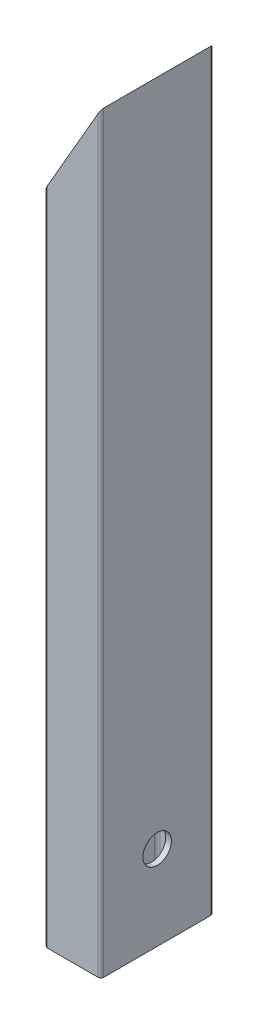
ISO-10303-21;
HEADER;
FILE_DESCRIPTION(('STEP AP214'),'2;1');
FILE_NAME('part.step','',(''),(''),'','','');
FILE_SCHEMA(('AUTOMOTIVE_DESIGN { 1 0 10303 214 1 1 1 1 }'));
ENDSEC;
DATA;
#1=APPLICATION_CONTEXT('core data for automotive mechanical design processes');
#2=APPLICATION_PROTOCOL_DEFINITION('international standard','automotive_design',2000,#1);
#3=PRODUCT_CONTEXT('',#1,'mechanical');
#4=PRODUCT('Part','Part','',(#3));
#5=PRODUCT_RELATED_PRODUCT_CATEGORY('part','',(#4));
#6=PRODUCT_DEFINITION_FORMATION('','',#4);
#7=PRODUCT_DEFINITION_CONTEXT('part definition',#1,'design');
#8=PRODUCT_DEFINITION('design','',#6,#7);
#9=PRODUCT_DEFINITION_SHAPE('','',#8);
#10=(LENGTH_UNIT() NAMED_UNIT(*) SI_UNIT(.MILLI.,.METRE.));
#11=(NAMED_UNIT(*) PLANE_ANGLE_UNIT() SI_UNIT($,.RADIAN.));
#12=(NAMED_UNIT(*) SI_UNIT($,.STERADIAN.) SOLID_ANGLE_UNIT());
#13=UNCERTAINTY_MEASURE_WITH_UNIT(LENGTH_MEASURE(1.E-05),#10,'distance_accuracy_value','');
#14=(GEOMETRIC_REPRESENTATION_CONTEXT(3) GLOBAL_UNCERTAINTY_ASSIGNED_CONTEXT((#13)) GLOBAL_UNIT_ASSIGNED_CONTEXT((#10,
#11,#12)) REPRESENTATION_CONTEXT('',''));
#15=CARTESIAN_POINT('',(0.,0.,0.));
#16=DIRECTION('',(0.,0.,1.));
#17=DIRECTION('',(1.,0.,0.));
#18=AXIS2_PLACEMENT_3D('',#15,#16,#17);
#19=CARTESIAN_POINT('',(2.,0.,-2.));
#20=DIRECTION('',(0.,-1.,0.));
#21=DIRECTION('',(0.,0.,-1.));
#22=AXIS2_PLACEMENT_3D('',#19,#20,#21);
#23=PLANE('',#22);
#24=CARTESIAN_POINT('',(2.,0.,-2.));
#25=DIRECTION('',(0.,1.,0.));
#26=DIRECTION('',(0.,0.,-1.));
#27=AXIS2_PLACEMENT_3D('',#24,#25,#26);
#28=CIRCLE('',#27,2.);
#29=CARTESIAN_POINT('',(0.,0.,-2.00000000000001));
#30=VERTEX_POINT('',#29);
#31=CARTESIAN_POINT('',(2.00000000000001,0.,0.));
#32=VERTEX_POINT('',#31);
#33=EDGE_CURVE('E238',#30,#32,#28,.T.);
#34=ORIENTED_EDGE('',*,*,#33,.F.);
#35=DIRECTION('',(0.,0.,1.));
#36=VECTOR('',#35,1.);
#37=CARTESIAN_POINT('',(0.,0.,-2.00000000000001));
#38=LINE('',#37,#36);
#39=CARTESIAN_POINT('',(0.,0.,-78.));
#40=VERTEX_POINT('',#39);
#41=EDGE_CURVE('E256',#40,#30,#38,.T.);
#42=ORIENTED_EDGE('',*,*,#41,.F.);
#43=CARTESIAN_POINT('',(2.,0.,-78.));
#44=DIRECTION('',(0.,1.,0.));
#45=DIRECTION('',(0.,0.,-1.));
#46=AXIS2_PLACEMENT_3D('',#43,#44,#45);
#47=CIRCLE('',#46,2.);
#48=CARTESIAN_POINT('',(2.,0.,-80.));
#49=VERTEX_POINT('',#48);
#50=EDGE_CURVE('E253',#49,#40,#47,.T.);
#51=ORIENTED_EDGE('',*,*,#50,.F.);
#52=DIRECTION('',(-1.,0.,0.));
#53=VECTOR('',#52,1.);
#54=CARTESIAN_POINT('',(2.,0.,-80.));
#55=LINE('',#54,#53);
#56=CARTESIAN_POINT('',(38.,0.,-80.));
#57=VERTEX_POINT('',#56);
#58=EDGE_CURVE('E250',#57,#49,#55,.T.);
#59=ORIENTED_EDGE('',*,*,#58,.F.);
#60=CARTESIAN_POINT('',(38.,0.,-78.));
#61=DIRECTION('',(0.,1.,0.));
#62=DIRECTION('',(0.,0.,-1.));
#63=AXIS2_PLACEMENT_3D('',#60,#61,#62);
#64=CIRCLE('',#63,2.);
#65=CARTESIAN_POINT('',(40.,0.,-78.));
#66=VERTEX_POINT('',#65);
#67=EDGE_CURVE('E248',#66,#57,#64,.T.);
#68=ORIENTED_EDGE('',*,*,#67,.F.);
#69=DIRECTION('',(0.,0.,-1.));
#70=VECTOR('',#69,1.);
#71=CARTESIAN_POINT('',(40.,0.,-2.00000000000001));
#72=LINE('',#71,#70);
#73=CARTESIAN_POINT('',(40.,0.,-2.00000000000001));
#74=VERTEX_POINT('',#73);
#75=EDGE_CURVE('E168',#74,#66,#72,.T.);
#76=ORIENTED_EDGE('',*,*,#75,.F.);
#77=CARTESIAN_POINT('',(38.,0.,-2.));
#78=DIRECTION('',(0.,1.,0.));
#79=DIRECTION('',(0.,0.,-1.));
#80=AXIS2_PLACEMENT_3D('',#77,#78,#79);
#81=CIRCLE('',#80,2.);
#82=CARTESIAN_POINT('',(38.,0.,0.));
#83=VERTEX_POINT('',#82);
#84=EDGE_CURVE('E244',#83,#74,#81,.T.);
#85=ORIENTED_EDGE('',*,*,#84,.F.);
#86=DIRECTION('',(1.,0.,0.));
#87=VECTOR('',#86,1.);
#88=CARTESIAN_POINT('',(2.00000000000001,0.,0.));
#89=LINE('',#88,#87);
#90=EDGE_CURVE('E241',#32,#83,#89,.T.);
#91=ORIENTED_EDGE('',*,*,#90,.F.);
#92=EDGE_LOOP('',(#34,#42,#51,#59,#68,#76,#85,#91));
#93=FACE_BOUND('',#92,.T.);
#94=DIRECTION('',(1.,0.,0.));
#95=VECTOR('',#94,1.);
#96=CARTESIAN_POINT('',(6.00000000000001,0.,-4.));
#97=LINE('',#96,#95);
#98=CARTESIAN_POINT('',(6.00000000000001,0.,-4.));
#99=VERTEX_POINT('',#98);
#100=CARTESIAN_POINT('',(34.,0.,-4.));
#101=VERTEX_POINT('',#100);
#102=EDGE_CURVE('E219',#99,#101,#97,.T.);
#103=ORIENTED_EDGE('',*,*,#102,.T.);
#104=CARTESIAN_POINT('',(34.,0.,-6.));
#105=DIRECTION('',(0.,1.,0.));
#106=DIRECTION('',(0.,0.,1.));
#107=AXIS2_PLACEMENT_3D('',#104,#105,#106);
#108=CIRCLE('',#107,2.);
#109=CARTESIAN_POINT('',(36.,0.,-6.00000000000001));
#110=VERTEX_POINT('',#109);
#111=EDGE_CURVE('E186',#101,#110,#108,.T.);
#112=ORIENTED_EDGE('',*,*,#111,.T.);
#113=DIRECTION('',(0.,0.,-1.));
#114=VECTOR('',#113,1.);
#115=CARTESIAN_POINT('',(36.,0.,-6.00000000000001));
#116=LINE('',#115,#114);
#117=CARTESIAN_POINT('',(36.,0.,-74.));
#118=VERTEX_POINT('',#117);
#119=EDGE_CURVE('E201',#110,#118,#116,.T.);
#120=ORIENTED_EDGE('',*,*,#119,.T.);
#121=CARTESIAN_POINT('',(34.,0.,-74.));
#122=DIRECTION('',(0.,1.,0.));
#123=DIRECTION('',(0.,0.,1.));
#124=AXIS2_PLACEMENT_3D('',#121,#122,#123);
#125=CIRCLE('',#124,2.);
#126=CARTESIAN_POINT('',(34.,0.,-76.));
#127=VERTEX_POINT('',#126);
#128=EDGE_CURVE('E204',#118,#127,#125,.T.);
#129=ORIENTED_EDGE('',*,*,#128,.T.);
#130=DIRECTION('',(-1.,0.,0.));
#131=VECTOR('',#130,1.);
#132=CARTESIAN_POINT('',(6.,0.,-76.));
#133=LINE('',#132,#131);
#134=CARTESIAN_POINT('',(6.,0.,-76.));
#135=VERTEX_POINT('',#134);
#136=EDGE_CURVE('E207',#127,#135,#133,.T.);
#137=ORIENTED_EDGE('',*,*,#136,.T.);
#138=CARTESIAN_POINT('',(6.,0.,-74.));
#139=DIRECTION('',(0.,1.,0.));
#140=DIRECTION('',(0.,0.,1.));
#141=AXIS2_PLACEMENT_3D('',#138,#139,#140);
#142=CIRCLE('',#141,2.);
#143=CARTESIAN_POINT('',(4.,0.,-74.));
#144=VERTEX_POINT('',#143);
#145=EDGE_CURVE('E210',#135,#144,#142,.T.);
#146=ORIENTED_EDGE('',*,*,#145,.T.);
#147=DIRECTION('',(0.,0.,1.));
#148=VECTOR('',#147,1.);
#149=CARTESIAN_POINT('',(4.,0.,-6.00000000000001));
#150=LINE('',#149,#148);
#151=CARTESIAN_POINT('',(4.,0.,-6.00000000000002));
#152=VERTEX_POINT('',#151);
#153=EDGE_CURVE('E213',#144,#152,#150,.T.);
#154=ORIENTED_EDGE('',*,*,#153,.T.);
#155=CARTESIAN_POINT('',(6.,0.,-6.));
#156=DIRECTION('',(0.,1.,0.));
#157=DIRECTION('',(0.,0.,1.));
#158=AXIS2_PLACEMENT_3D('',#155,#156,#157);
#159=CIRCLE('',#158,2.);
#160=EDGE_CURVE('E216',#152,#99,#159,.T.);
#161=ORIENTED_EDGE('',*,*,#160,.T.);
#162=EDGE_LOOP('',(#103,#112,#120,#129,#137,#146,#154,#161));
#163=FACE_BOUND('',#162,.T.);
#164=ADVANCED_FACE('F35',(#93,#163),#23,.T.);
#165=CARTESIAN_POINT('',(2.,675.,-2.));
#166=DIRECTION('',(0.,-1.,0.));
#167=DIRECTION('',(0.,0.,-1.));
#168=AXIS2_PLACEMENT_3D('',#165,#166,#167);
#169=CYLINDRICAL_SURFACE('',#168,2.);
#170=DIRECTION('',(0.,-1.,0.));
#171=VECTOR('',#170,1.);
#172=CARTESIAN_POINT('',(2.00000000000001,675.,0.));
#173=LINE('',#172,#171);
#174=CARTESIAN_POINT('',(1.99999999999997,469.182069312382,0.));
#175=VERTEX_POINT('',#174);
#176=EDGE_CURVE('E43',#175,#32,#173,.T.);
#177=ORIENTED_EDGE('',*,*,#176,.F.);
#178=CARTESIAN_POINT('',(2.,469.182069312382,-2.));
#179=DIRECTION('',(0.86602540378444,-0.499999999999998,0.));
#180=DIRECTION('',(-0.499999999999998,-0.86602540378444,0.));
#181=AXIS2_PLACEMENT_3D('',#178,#179,#180);
#182=ELLIPSE('',#181,4.00000000000002,2.);
#183=CARTESIAN_POINT('',(0.,465.717967697244,-2.00000000000002));
#184=VERTEX_POINT('',#183);
#185=EDGE_CURVE('E194',#175,#184,#182,.T.);
#186=ORIENTED_EDGE('',*,*,#185,.T.);
#187=DIRECTION('',(0.,-1.,0.));
#188=VECTOR('',#187,1.);
#189=CARTESIAN_POINT('',(0.,675.,-2.00000000000001));
#190=LINE('',#189,#188);
#191=EDGE_CURVE('E259',#184,#30,#190,.T.);
#192=ORIENTED_EDGE('',*,*,#191,.T.);
#193=ORIENTED_EDGE('',*,*,#33,.T.);
#194=EDGE_LOOP('',(#177,#186,#192,#193));
#195=FACE_BOUND('',#194,.T.);
#196=ADVANCED_FACE('F37',(#195),#169,.T.);
#197=CARTESIAN_POINT('',(2.00000000000001,675.,0.));
#198=DIRECTION('',(0.,0.,-1.));
#199=DIRECTION('',(-1.,0.,0.));
#200=AXIS2_PLACEMENT_3D('',#197,#198,#199);
#201=PLANE('',#200);
#202=DIRECTION('',(0.,-1.,0.));
#203=VECTOR('',#202,1.);
#204=CARTESIAN_POINT('',(38.,675.,0.));
#205=LINE('',#204,#203);
#206=CARTESIAN_POINT('',(38.,531.535898384862,0.));
#207=VERTEX_POINT('',#206);
#208=EDGE_CURVE('E172',#207,#83,#205,.T.);
#209=ORIENTED_EDGE('',*,*,#208,.F.);
#210=DIRECTION('',(0.499999999999998,0.86602540378444,0.));
#211=VECTOR('',#210,1.);
#212=CARTESIAN_POINT('',(40.,535.,0.));
#213=LINE('',#212,#211);
#214=EDGE_CURVE('E281',#175,#207,#213,.T.);
#215=ORIENTED_EDGE('',*,*,#214,.F.);
#216=ORIENTED_EDGE('',*,*,#176,.T.);
#217=ORIENTED_EDGE('',*,*,#90,.T.);
#218=EDGE_LOOP('',(#209,#215,#216,#217));
#219=FACE_BOUND('',#218,.T.);
#220=ADVANCED_FACE('F303',(#219),#201,.F.);
#221=CARTESIAN_POINT('',(38.,675.,-2.));
#222=DIRECTION('',(0.,-1.,0.));
#223=DIRECTION('',(0.,0.,-1.));
#224=AXIS2_PLACEMENT_3D('',#221,#222,#223);
#225=CYLINDRICAL_SURFACE('',#224,2.);
#226=DIRECTION('',(0.,-1.,0.));
#227=VECTOR('',#226,1.);
#228=CARTESIAN_POINT('',(40.,675.,-2.00000000000001));
#229=LINE('',#228,#227);
#230=CARTESIAN_POINT('',(40.,535.,-2.00000000000002));
#231=VERTEX_POINT('',#230);
#232=EDGE_CURVE('E170',#231,#74,#229,.T.);
#233=ORIENTED_EDGE('',*,*,#232,.F.);
#234=CARTESIAN_POINT('',(38.,531.535898384862,-2.));
#235=DIRECTION('',(0.86602540378444,-0.499999999999998,0.));
#236=DIRECTION('',(-0.499999999999998,-0.86602540378444,0.));
#237=AXIS2_PLACEMENT_3D('',#234,#235,#236);
#238=ELLIPSE('',#237,4.00000000000002,2.);
#239=EDGE_CURVE('E151',#231,#207,#238,.T.);
#240=ORIENTED_EDGE('',*,*,#239,.T.);
#241=ORIENTED_EDGE('',*,*,#208,.T.);
#242=ORIENTED_EDGE('',*,*,#84,.T.);
#243=EDGE_LOOP('',(#233,#240,#241,#242));
#244=FACE_BOUND('',#243,.T.);
#245=ADVANCED_FACE('F305',(#244),#225,.T.);
#246=CARTESIAN_POINT('',(40.,675.,-2.00000000000001));
#247=DIRECTION('',(-1.,0.,0.));
#248=DIRECTION('',(0.,0.,1.));
#249=AXIS2_PLACEMENT_3D('',#246,#247,#248);
#250=PLANE('',#249);
#251=CARTESIAN_POINT('',(40.,60.,-40.));
#252=DIRECTION('',(1.,0.,0.));
#253=DIRECTION('',(0.,0.,-1.));
#254=AXIS2_PLACEMENT_3D('',#251,#252,#253);
#255=CIRCLE('',#254,10.125);
#256=CARTESIAN_POINT('',(40.,60.,-50.125));
#257=VERTEX_POINT('',#256);
#258=EDGE_CURVE('E189',#257,#257,#255,.T.);
#259=ORIENTED_EDGE('',*,*,#258,.F.);
#260=EDGE_LOOP('',(#259));
#261=FACE_BOUND('',#260,.T.);
#262=DIRECTION('',(0.,-1.,0.));
#263=VECTOR('',#262,1.);
#264=CARTESIAN_POINT('',(40.,675.,-78.));
#265=LINE('',#264,#263);
#266=CARTESIAN_POINT('',(40.,535.,-78.));
#267=VERTEX_POINT('',#266);
#268=EDGE_CURVE('E162',#267,#66,#265,.T.);
#269=ORIENTED_EDGE('',*,*,#268,.F.);
#270=DIRECTION('',(0.,0.,1.));
#271=VECTOR('',#270,1.);
#272=CARTESIAN_POINT('',(40.,535.,-80.));
#273=LINE('',#272,#271);
#274=EDGE_CURVE('E145',#267,#231,#273,.T.);
#275=ORIENTED_EDGE('',*,*,#274,.T.);
#276=ORIENTED_EDGE('',*,*,#232,.T.);
#277=ORIENTED_EDGE('',*,*,#75,.T.);
#278=EDGE_LOOP('',(#269,#275,#276,#277));
#279=FACE_BOUND('',#278,.T.);
#280=ADVANCED_FACE('F166',(#261,#279),#250,.F.);
#281=CARTESIAN_POINT('',(38.,675.,-78.));
#282=DIRECTION('',(0.,-1.,0.));
#283=DIRECTION('',(0.,0.,-1.));
#284=AXIS2_PLACEMENT_3D('',#281,#282,#283);
#285=CYLINDRICAL_SURFACE('',#284,2.);
#286=DIRECTION('',(0.,-1.,0.));
#287=VECTOR('',#286,1.);
#288=CARTESIAN_POINT('',(38.,675.,-80.));
#289=LINE('',#288,#287);
#290=CARTESIAN_POINT('',(38.,531.535898384862,-80.));
#291=VERTEX_POINT('',#290);
#292=EDGE_CURVE('E164',#291,#57,#289,.T.);
#293=ORIENTED_EDGE('',*,*,#292,.F.);
#294=CARTESIAN_POINT('',(38.,531.535898384862,-78.));
#295=DIRECTION('',(0.86602540378444,-0.499999999999998,0.));
#296=DIRECTION('',(-0.499999999999998,-0.86602540378444,0.));
#297=AXIS2_PLACEMENT_3D('',#294,#295,#296);
#298=ELLIPSE('',#297,4.00000000000002,2.);
#299=EDGE_CURVE('E148',#291,#267,#298,.T.);
#300=ORIENTED_EDGE('',*,*,#299,.T.);
#301=ORIENTED_EDGE('',*,*,#268,.T.);
#302=ORIENTED_EDGE('',*,*,#67,.T.);
#303=EDGE_LOOP('',(#293,#300,#301,#302));
#304=FACE_BOUND('',#303,.T.);
#305=ADVANCED_FACE('F160',(#304),#285,.T.);
#306=CARTESIAN_POINT('',(2.,675.,-80.));
#307=DIRECTION('',(0.,0.,1.));
#308=DIRECTION('',(1.,0.,0.));
#309=AXIS2_PLACEMENT_3D('',#306,#307,#308);
#310=PLANE('',#309);
#311=DIRECTION('',(0.,-1.,0.));
#312=VECTOR('',#311,1.);
#313=CARTESIAN_POINT('',(2.,675.,-80.));
#314=LINE('',#313,#312);
#315=CARTESIAN_POINT('',(2.00000000000001,469.182069312382,-80.));
#316=VERTEX_POINT('',#315);
#317=EDGE_CURVE('E174',#316,#49,#314,.T.);
#318=ORIENTED_EDGE('',*,*,#317,.F.);
#319=DIRECTION('',(0.499999999999998,0.86602540378444,0.));
#320=VECTOR('',#319,1.);
#321=CARTESIAN_POINT('',(40.,535.,-80.));
#322=LINE('',#321,#320);
#323=EDGE_CURVE('E279',#316,#291,#322,.T.);
#324=ORIENTED_EDGE('',*,*,#323,.T.);
#325=ORIENTED_EDGE('',*,*,#292,.T.);
#326=ORIENTED_EDGE('',*,*,#58,.T.);
#327=EDGE_LOOP('',(#318,#324,#325,#326));
#328=FACE_BOUND('',#327,.T.);
#329=ADVANCED_FACE('F270',(#328),#310,.F.);
#330=CARTESIAN_POINT('',(2.,675.,-78.));
#331=DIRECTION('',(0.,-1.,0.));
#332=DIRECTION('',(0.,0.,-1.));
#333=AXIS2_PLACEMENT_3D('',#330,#331,#332);
#334=CYLINDRICAL_SURFACE('',#333,2.);
#335=DIRECTION('',(0.,-1.,0.));
#336=VECTOR('',#335,1.);
#337=CARTESIAN_POINT('',(0.,675.,-78.));
#338=LINE('',#337,#336);
#339=CARTESIAN_POINT('',(0.,465.717967697244,-78.));
#340=VERTEX_POINT('',#339);
#341=EDGE_CURVE('E261',#340,#40,#338,.T.);
#342=ORIENTED_EDGE('',*,*,#341,.F.);
#343=CARTESIAN_POINT('',(2.,469.182069312382,-78.));
#344=DIRECTION('',(0.86602540378444,-0.499999999999998,0.));
#345=DIRECTION('',(-0.499999999999998,-0.86602540378444,0.));
#346=AXIS2_PLACEMENT_3D('',#343,#344,#345);
#347=ELLIPSE('',#346,4.00000000000002,2.);
#348=EDGE_CURVE('E50',#340,#316,#347,.T.);
#349=ORIENTED_EDGE('',*,*,#348,.T.);
#350=ORIENTED_EDGE('',*,*,#317,.T.);
#351=ORIENTED_EDGE('',*,*,#50,.T.);
#352=EDGE_LOOP('',(#342,#349,#350,#351));
#353=FACE_BOUND('',#352,.T.);
#354=ADVANCED_FACE('F265',(#353),#334,.T.);
#355=CARTESIAN_POINT('',(0.,675.,-2.00000000000001));
#356=DIRECTION('',(1.,0.,0.));
#357=DIRECTION('',(0.,0.,-1.));
#358=AXIS2_PLACEMENT_3D('',#355,#356,#357);
#359=PLANE('',#358);
#360=CARTESIAN_POINT('',(0.,60.,-40.));
#361=DIRECTION('',(1.,0.,0.));
#362=DIRECTION('',(0.,0.,-1.));
#363=AXIS2_PLACEMENT_3D('',#360,#361,#362);
#364=CIRCLE('',#363,10.125);
#365=CARTESIAN_POINT('',(0.,60.,-50.125));
#366=VERTEX_POINT('',#365);
#367=EDGE_CURVE('E182',#366,#366,#364,.T.);
#368=ORIENTED_EDGE('',*,*,#367,.T.);
#369=EDGE_LOOP('',(#368));
#370=FACE_BOUND('',#369,.T.);
#371=ORIENTED_EDGE('',*,*,#191,.F.);
#372=DIRECTION('',(0.,0.,1.));
#373=VECTOR('',#372,1.);
#374=CARTESIAN_POINT('',(0.,465.717967697244,-80.));
#375=LINE('',#374,#373);
#376=EDGE_CURVE('E156',#340,#184,#375,.T.);
#377=ORIENTED_EDGE('',*,*,#376,.F.);
#378=ORIENTED_EDGE('',*,*,#341,.T.);
#379=ORIENTED_EDGE('',*,*,#41,.T.);
#380=EDGE_LOOP('',(#371,#377,#378,#379));
#381=FACE_BOUND('',#380,.T.);
#382=ADVANCED_FACE('F277',(#370,#381),#359,.F.);
#383=CARTESIAN_POINT('',(34.,675.,-6.));
#384=DIRECTION('',(0.,-1.,0.));
#385=DIRECTION('',(0.,0.,-1.));
#386=AXIS2_PLACEMENT_3D('',#383,#384,#385);
#387=CYLINDRICAL_SURFACE('',#386,2.);
#388=CARTESIAN_POINT('',(34.,524.607695154587,-6.));
#389=DIRECTION('',(0.86602540378444,-0.499999999999998,0.));
#390=DIRECTION('',(-0.499999999999998,-0.86602540378444,0.));
#391=AXIS2_PLACEMENT_3D('',#388,#389,#390);
#392=ELLIPSE('',#391,4.00000000000002,2.);
#393=CARTESIAN_POINT('',(36.,528.071796769725,-6.00000000000001));
#394=VERTEX_POINT('',#393);
#395=CARTESIAN_POINT('',(34.,524.607695154587,-4.));
#396=VERTEX_POINT('',#395);
#397=EDGE_CURVE('E57',#394,#396,#392,.T.);
#398=ORIENTED_EDGE('',*,*,#397,.F.);
#399=DIRECTION('',(0.,-1.,0.));
#400=VECTOR('',#399,1.);
#401=CARTESIAN_POINT('',(36.,675.,-6.00000000000001));
#402=LINE('',#401,#400);
#403=EDGE_CURVE('E236',#394,#110,#402,.T.);
#404=ORIENTED_EDGE('',*,*,#403,.T.);
#405=ORIENTED_EDGE('',*,*,#111,.F.);
#406=DIRECTION('',(0.,-1.,0.));
#407=VECTOR('',#406,1.);
#408=CARTESIAN_POINT('',(34.,675.,-4.));
#409=LINE('',#408,#407);
#410=EDGE_CURVE('E222',#396,#101,#409,.T.);
#411=ORIENTED_EDGE('',*,*,#410,.F.);
#412=EDGE_LOOP('',(#398,#404,#405,#411));
#413=FACE_BOUND('',#412,.T.);
#414=ADVANCED_FACE('F321',(#413),#387,.F.);
#415=CARTESIAN_POINT('',(36.,675.,-6.00000000000001));
#416=DIRECTION('',(-1.,0.,0.));
#417=DIRECTION('',(0.,0.,1.));
#418=AXIS2_PLACEMENT_3D('',#415,#416,#417);
#419=PLANE('',#418);
#420=DIRECTION('',(0.,0.,1.));
#421=VECTOR('',#420,1.);
#422=CARTESIAN_POINT('',(36.,528.071796769725,-6.00000000000001));
#423=LINE('',#422,#421);
#424=CARTESIAN_POINT('',(36.,528.071796769725,-74.));
#425=VERTEX_POINT('',#424);
#426=EDGE_CURVE('E294',#425,#394,#423,.T.);
#427=ORIENTED_EDGE('',*,*,#426,.F.);
#428=DIRECTION('',(0.,-1.,0.));
#429=VECTOR('',#428,1.);
#430=CARTESIAN_POINT('',(36.,675.,-74.));
#431=LINE('',#430,#429);
#432=EDGE_CURVE('E234',#425,#118,#431,.T.);
#433=ORIENTED_EDGE('',*,*,#432,.T.);
#434=ORIENTED_EDGE('',*,*,#119,.F.);
#435=ORIENTED_EDGE('',*,*,#403,.F.);
#436=EDGE_LOOP('',(#427,#433,#434,#435));
#437=FACE_BOUND('',#436,.T.);
#438=CARTESIAN_POINT('',(36.,60.,-40.));
#439=DIRECTION('',(-1.,0.,0.));
#440=DIRECTION('',(0.,0.,1.));
#441=AXIS2_PLACEMENT_3D('',#438,#439,#440);
#442=CIRCLE('',#441,10.125);
#443=CARTESIAN_POINT('',(36.,60.,-29.875));
#444=VERTEX_POINT('',#443);
#445=EDGE_CURVE('E181',#444,#444,#442,.T.);
#446=ORIENTED_EDGE('',*,*,#445,.F.);
#447=EDGE_LOOP('',(#446));
#448=FACE_BOUND('',#447,.T.);
#449=ADVANCED_FACE('F352',(#437,#448),#419,.T.);
#450=CARTESIAN_POINT('',(34.,675.,-74.));
#451=DIRECTION('',(0.,-1.,0.));
#452=DIRECTION('',(0.,0.,-1.));
#453=AXIS2_PLACEMENT_3D('',#450,#451,#452);
#454=CYLINDRICAL_SURFACE('',#453,2.);
#455=CARTESIAN_POINT('',(34.,524.607695154587,-74.));
#456=DIRECTION('',(0.86602540378444,-0.499999999999998,0.));
#457=DIRECTION('',(-0.499999999999998,-0.86602540378444,0.));
#458=AXIS2_PLACEMENT_3D('',#455,#456,#457);
#459=ELLIPSE('',#458,4.00000000000002,2.);
#460=CARTESIAN_POINT('',(34.,524.607695154587,-76.));
#461=VERTEX_POINT('',#460);
#462=EDGE_CURVE('E292',#461,#425,#459,.T.);
#463=ORIENTED_EDGE('',*,*,#462,.F.);
#464=DIRECTION('',(0.,-1.,0.));
#465=VECTOR('',#464,1.);
#466=CARTESIAN_POINT('',(34.,675.,-76.));
#467=LINE('',#466,#465);
#468=EDGE_CURVE('E232',#461,#127,#467,.T.);
#469=ORIENTED_EDGE('',*,*,#468,.T.);
#470=ORIENTED_EDGE('',*,*,#128,.F.);
#471=ORIENTED_EDGE('',*,*,#432,.F.);
#472=EDGE_LOOP('',(#463,#469,#470,#471));
#473=FACE_BOUND('',#472,.T.);
#474=ADVANCED_FACE('F359',(#473),#454,.F.);
#475=CARTESIAN_POINT('',(6.,675.,-76.));
#476=DIRECTION('',(0.,0.,1.));
#477=DIRECTION('',(1.,0.,0.));
#478=AXIS2_PLACEMENT_3D('',#475,#476,#477);
#479=PLANE('',#478);
#480=DIRECTION('',(0.499999999999998,0.86602540378444,0.));
#481=VECTOR('',#480,1.);
#482=CARTESIAN_POINT('',(92.1217782649106,625.277568135665,-76.));
#483=LINE('',#482,#481);
#484=CARTESIAN_POINT('',(6.,476.110272542658,-76.));
#485=VERTEX_POINT('',#484);
#486=EDGE_CURVE('E290',#485,#461,#483,.T.);
#487=ORIENTED_EDGE('',*,*,#486,.F.);
#488=DIRECTION('',(0.,-1.,0.));
#489=VECTOR('',#488,1.);
#490=CARTESIAN_POINT('',(6.,675.,-76.));
#491=LINE('',#490,#489);
#492=EDGE_CURVE('E230',#485,#135,#491,.T.);
#493=ORIENTED_EDGE('',*,*,#492,.T.);
#494=ORIENTED_EDGE('',*,*,#136,.F.);
#495=ORIENTED_EDGE('',*,*,#468,.F.);
#496=EDGE_LOOP('',(#487,#493,#494,#495));
#497=FACE_BOUND('',#496,.T.);
#498=ADVANCED_FACE('F366',(#497),#479,.T.);
#499=CARTESIAN_POINT('',(6.,675.,-74.));
#500=DIRECTION('',(0.,-1.,0.));
#501=DIRECTION('',(0.,0.,-1.));
#502=AXIS2_PLACEMENT_3D('',#499,#500,#501);
#503=CYLINDRICAL_SURFACE('',#502,2.);
#504=CARTESIAN_POINT('',(6.,476.110272542658,-74.));
#505=DIRECTION('',(0.86602540378444,-0.499999999999998,0.));
#506=DIRECTION('',(-0.499999999999998,-0.86602540378444,0.));
#507=AXIS2_PLACEMENT_3D('',#504,#505,#506);
#508=ELLIPSE('',#507,4.00000000000002,2.);
#509=CARTESIAN_POINT('',(4.,472.64617092752,-74.));
#510=VERTEX_POINT('',#509);
#511=EDGE_CURVE('E288',#510,#485,#508,.T.);
#512=ORIENTED_EDGE('',*,*,#511,.F.);
#513=DIRECTION('',(0.,-1.,0.));
#514=VECTOR('',#513,1.);
#515=CARTESIAN_POINT('',(4.,675.,-74.));
#516=LINE('',#515,#514);
#517=EDGE_CURVE('E228',#510,#144,#516,.T.);
#518=ORIENTED_EDGE('',*,*,#517,.T.);
#519=ORIENTED_EDGE('',*,*,#145,.F.);
#520=ORIENTED_EDGE('',*,*,#492,.F.);
#521=EDGE_LOOP('',(#512,#518,#519,#520));
#522=FACE_BOUND('',#521,.T.);
#523=ADVANCED_FACE('F374',(#522),#503,.F.);
#524=CARTESIAN_POINT('',(4.,675.,-6.00000000000001));
#525=DIRECTION('',(1.,0.,0.));
#526=DIRECTION('',(0.,0.,-1.));
#527=AXIS2_PLACEMENT_3D('',#524,#525,#526);
#528=PLANE('',#527);
#529=DIRECTION('',(0.,0.,-1.));
#530=VECTOR('',#529,1.);
#531=CARTESIAN_POINT('',(4.,472.64617092752,-6.00000000000001));
#532=LINE('',#531,#530);
#533=CARTESIAN_POINT('',(4.,472.64617092752,-6.00000000000002));
#534=VERTEX_POINT('',#533);
#535=EDGE_CURVE('E286',#534,#510,#532,.T.);
#536=ORIENTED_EDGE('',*,*,#535,.F.);
#537=DIRECTION('',(0.,-1.,0.));
#538=VECTOR('',#537,1.);
#539=CARTESIAN_POINT('',(4.,675.,-6.00000000000002));
#540=LINE('',#539,#538);
#541=EDGE_CURVE('E226',#534,#152,#540,.T.);
#542=ORIENTED_EDGE('',*,*,#541,.T.);
#543=ORIENTED_EDGE('',*,*,#153,.F.);
#544=ORIENTED_EDGE('',*,*,#517,.F.);
#545=EDGE_LOOP('',(#536,#542,#543,#544));
#546=FACE_BOUND('',#545,.T.);
#547=CARTESIAN_POINT('',(4.,60.,-40.));
#548=DIRECTION('',(1.,0.,0.));
#549=DIRECTION('',(0.,0.,-1.));
#550=AXIS2_PLACEMENT_3D('',#547,#548,#549);
#551=CIRCLE('',#550,10.125);
#552=CARTESIAN_POINT('',(4.,60.,-50.125));
#553=VERTEX_POINT('',#552);
#554=EDGE_CURVE('E179',#553,#553,#551,.T.);
#555=ORIENTED_EDGE('',*,*,#554,.F.);
#556=EDGE_LOOP('',(#555));
#557=FACE_BOUND('',#556,.T.);
#558=ADVANCED_FACE('F382',(#546,#557),#528,.T.);
#559=CARTESIAN_POINT('',(6.,675.,-6.));
#560=DIRECTION('',(0.,-1.,0.));
#561=DIRECTION('',(0.,0.,-1.));
#562=AXIS2_PLACEMENT_3D('',#559,#560,#561);
#563=CYLINDRICAL_SURFACE('',#562,2.);
#564=CARTESIAN_POINT('',(6.,476.110272542658,-6.));
#565=DIRECTION('',(0.86602540378444,-0.499999999999998,0.));
#566=DIRECTION('',(-0.499999999999998,-0.86602540378444,0.));
#567=AXIS2_PLACEMENT_3D('',#564,#565,#566);
#568=ELLIPSE('',#567,4.00000000000002,2.);
#569=CARTESIAN_POINT('',(6.00000000000002,476.110272542658,-4.));
#570=VERTEX_POINT('',#569);
#571=EDGE_CURVE('E155',#570,#534,#568,.T.);
#572=ORIENTED_EDGE('',*,*,#571,.F.);
#573=DIRECTION('',(0.,-1.,0.));
#574=VECTOR('',#573,1.);
#575=CARTESIAN_POINT('',(6.00000000000001,675.,-4.));
#576=LINE('',#575,#574);
#577=EDGE_CURVE('E224',#570,#99,#576,.T.);
#578=ORIENTED_EDGE('',*,*,#577,.T.);
#579=ORIENTED_EDGE('',*,*,#160,.F.);
#580=ORIENTED_EDGE('',*,*,#541,.F.);
#581=EDGE_LOOP('',(#572,#578,#579,#580));
#582=FACE_BOUND('',#581,.T.);
#583=ADVANCED_FACE('F390',(#582),#563,.F.);
#584=CARTESIAN_POINT('',(6.00000000000001,675.,-4.));
#585=DIRECTION('',(0.,0.,-1.));
#586=DIRECTION('',(-1.,0.,0.));
#587=AXIS2_PLACEMENT_3D('',#584,#585,#586);
#588=PLANE('',#587);
#589=DIRECTION('',(-0.499999999999998,-0.86602540378444,0.));
#590=VECTOR('',#589,1.);
#591=CARTESIAN_POINT('',(92.1217782649106,625.277568135665,-4.));
#592=LINE('',#591,#590);
#593=EDGE_CURVE('E11',#396,#570,#592,.T.);
#594=ORIENTED_EDGE('',*,*,#593,.F.);
#595=ORIENTED_EDGE('',*,*,#410,.T.);
#596=ORIENTED_EDGE('',*,*,#102,.F.);
#597=ORIENTED_EDGE('',*,*,#577,.F.);
#598=EDGE_LOOP('',(#594,#595,#596,#597));
#599=FACE_BOUND('',#598,.T.);
#600=ADVANCED_FACE('F398',(#599),#588,.T.);
#601=CARTESIAN_POINT('',(0.,60.,-40.));
#602=DIRECTION('',(1.,0.,0.));
#603=DIRECTION('',(0.,0.,-1.));
#604=AXIS2_PLACEMENT_3D('',#601,#602,#603);
#605=CYLINDRICAL_SURFACE('',#604,10.125);
#606=ORIENTED_EDGE('',*,*,#554,.T.);
#607=EDGE_LOOP('',(#606));
#608=FACE_BOUND('',#607,.T.);
#609=ORIENTED_EDGE('',*,*,#367,.F.);
#610=EDGE_LOOP('',(#609));
#611=FACE_BOUND('',#610,.T.);
#612=ADVANCED_FACE('F406',(#608,#611),#605,.F.);
#613=ORIENTED_EDGE('',*,*,#445,.T.);
#614=EDGE_LOOP('',(#613));
#615=FACE_BOUND('',#614,.T.);
#616=ORIENTED_EDGE('',*,*,#258,.T.);
#617=EDGE_LOOP('',(#616));
#618=FACE_BOUND('',#617,.T.);
#619=ADVANCED_FACE('F415',(#615,#618),#605,.F.);
#620=CARTESIAN_POINT('',(40.,535.,-80.));
#621=DIRECTION('',(0.86602540378444,-0.499999999999998,0.));
#622=DIRECTION('',(0.499999999999998,0.86602540378444,0.));
#623=AXIS2_PLACEMENT_3D('',#620,#621,#622);
#624=PLANE('',#623);
#625=ORIENTED_EDGE('',*,*,#397,.T.);
#626=ORIENTED_EDGE('',*,*,#593,.T.);
#627=ORIENTED_EDGE('',*,*,#571,.T.);
#628=ORIENTED_EDGE('',*,*,#535,.T.);
#629=ORIENTED_EDGE('',*,*,#511,.T.);
#630=ORIENTED_EDGE('',*,*,#486,.T.);
#631=ORIENTED_EDGE('',*,*,#462,.T.);
#632=ORIENTED_EDGE('',*,*,#426,.T.);
#633=EDGE_LOOP('',(#625,#626,#627,#628,#629,#630,#631,#632));
#634=FACE_BOUND('',#633,.T.);
#635=ORIENTED_EDGE('',*,*,#214,.T.);
#636=ORIENTED_EDGE('',*,*,#239,.F.);
#637=ORIENTED_EDGE('',*,*,#274,.F.);
#638=ORIENTED_EDGE('',*,*,#299,.F.);
#639=ORIENTED_EDGE('',*,*,#323,.F.);
#640=ORIENTED_EDGE('',*,*,#348,.F.);
#641=ORIENTED_EDGE('',*,*,#376,.T.);
#642=ORIENTED_EDGE('',*,*,#185,.F.);
#643=EDGE_LOOP('',(#635,#636,#637,#638,#639,#640,#641,#642));
#644=FACE_BOUND('',#643,.T.);
#645=ADVANCED_FACE('F147',(#634,#644),#624,.F.);
#646=CLOSED_SHELL('',(#164,#196,#220,#245,#280,#305,#329,#354,#382,#414,#449,#474,#498,#523,
#558,#583,#600,#612,#619,#645));
#647=MANIFOLD_SOLID_BREP('B2',#646);
#648=ADVANCED_BREP_SHAPE_REPRESENTATION('',(#18,#647),#14);
#649=SHAPE_DEFINITION_REPRESENTATION(#9,#648);
ENDSEC;
END-ISO-10303-21;
